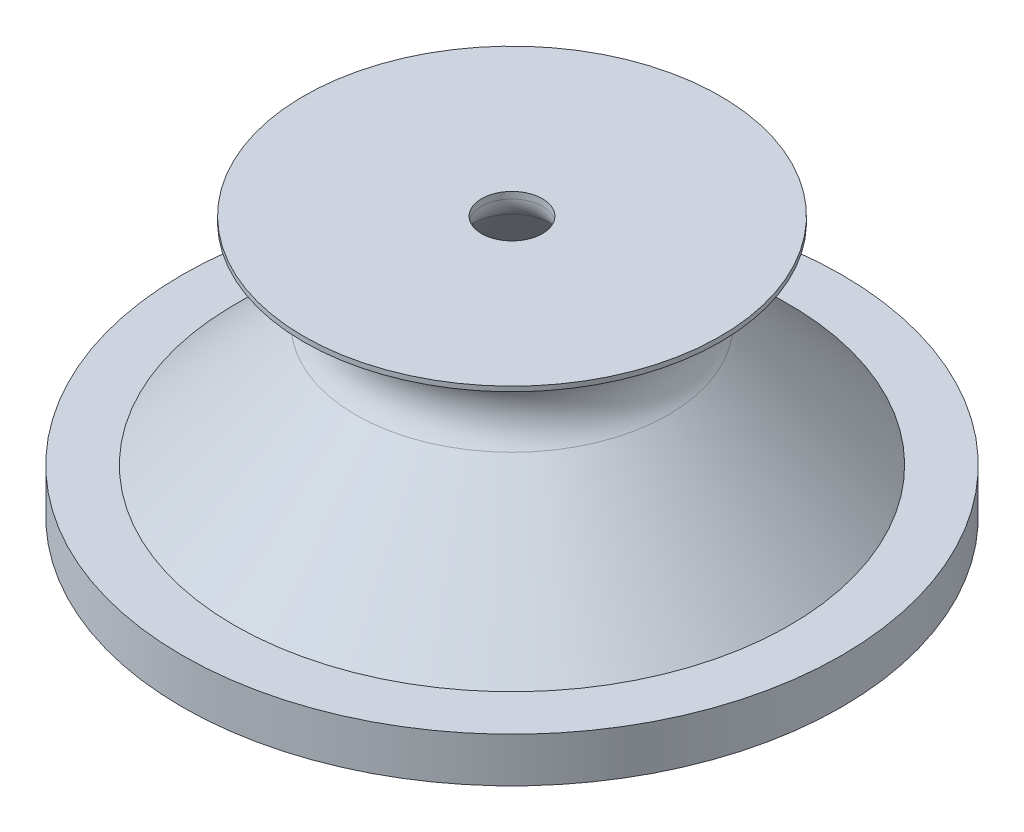
ISO-10303-21;
HEADER;
FILE_DESCRIPTION(('STEP AP214'),'2;1');
FILE_NAME('part.step','',(''),(''),'','','');
FILE_SCHEMA(('AUTOMOTIVE_DESIGN { 1 0 10303 214 1 1 1 1 }'));
ENDSEC;
DATA;
#1=APPLICATION_CONTEXT('core data for automotive mechanical design processes');
#2=APPLICATION_PROTOCOL_DEFINITION('international standard','automotive_design',2000,#1);
#3=PRODUCT_CONTEXT('',#1,'mechanical');
#4=PRODUCT('Part','Part','',(#3));
#5=PRODUCT_RELATED_PRODUCT_CATEGORY('part','',(#4));
#6=PRODUCT_DEFINITION_FORMATION('','',#4);
#7=PRODUCT_DEFINITION_CONTEXT('part definition',#1,'design');
#8=PRODUCT_DEFINITION('design','',#6,#7);
#9=PRODUCT_DEFINITION_SHAPE('','',#8);
#10=(LENGTH_UNIT() NAMED_UNIT(*) SI_UNIT(.MILLI.,.METRE.));
#11=(NAMED_UNIT(*) PLANE_ANGLE_UNIT() SI_UNIT($,.RADIAN.));
#12=(NAMED_UNIT(*) SI_UNIT($,.STERADIAN.) SOLID_ANGLE_UNIT());
#13=UNCERTAINTY_MEASURE_WITH_UNIT(LENGTH_MEASURE(1.E-05),#10,'distance_accuracy_value','');
#14=(GEOMETRIC_REPRESENTATION_CONTEXT(3) GLOBAL_UNCERTAINTY_ASSIGNED_CONTEXT((#13)) GLOBAL_UNIT_ASSIGNED_CONTEXT((#10,
#11,#12)) REPRESENTATION_CONTEXT('',''));
#15=CARTESIAN_POINT('',(0.,0.,0.));
#16=DIRECTION('',(0.,0.,1.));
#17=DIRECTION('',(1.,0.,0.));
#18=AXIS2_PLACEMENT_3D('',#15,#16,#17);
#19=CARTESIAN_POINT('',(0.,49.2844881441796,0.));
#20=DIRECTION('',(0.,1.,0.));
#21=DIRECTION('',(0.,0.,1.));
#22=AXIS2_PLACEMENT_3D('',#19,#20,#21);
#23=CYLINDRICAL_SURFACE('',#22,38.);
#24=CARTESIAN_POINT('',(0.,5.1568542494921,0.));
#25=DIRECTION('',(0.,1.,0.));
#26=DIRECTION('',(0.,0.,1.));
#27=AXIS2_PLACEMENT_3D('',#24,#25,#26);
#28=CIRCLE('',#27,38.);
#29=CARTESIAN_POINT('',(0.,5.1568542494921,38.));
#30=VERTEX_POINT('',#29);
#31=EDGE_CURVE('E10',#30,#30,#28,.T.);
#32=ORIENTED_EDGE('',*,*,#31,.F.);
#33=EDGE_LOOP('',(#32));
#34=FACE_BOUND('',#33,.T.);
#35=CARTESIAN_POINT('',(0.,0.,0.));
#36=DIRECTION('',(0.,1.,0.));
#37=DIRECTION('',(0.,0.,1.));
#38=AXIS2_PLACEMENT_3D('',#35,#36,#37);
#39=CIRCLE('',#38,38.);
#40=CARTESIAN_POINT('',(0.,0.,38.));
#41=VERTEX_POINT('',#40);
#42=EDGE_CURVE('E70',#41,#41,#39,.T.);
#43=ORIENTED_EDGE('',*,*,#42,.T.);
#44=EDGE_LOOP('',(#43));
#45=FACE_BOUND('',#44,.T.);
#46=ADVANCED_FACE('F33',(#34,#45),#23,.T.);
#47=CARTESIAN_POINT('',(32.,5.1568542494921,0.));
#48=DIRECTION('',(0.,-1.,0.));
#49=DIRECTION('',(0.,0.,-1.));
#50=AXIS2_PLACEMENT_3D('',#47,#48,#49);
#51=PLANE('',#50);
#52=CARTESIAN_POINT('',(0.,5.1568542494921,0.));
#53=DIRECTION('',(0.,1.,0.));
#54=DIRECTION('',(0.,0.,1.));
#55=AXIS2_PLACEMENT_3D('',#52,#53,#54);
#56=CIRCLE('',#55,32.);
#57=CARTESIAN_POINT('',(0.,5.1568542494921,32.));
#58=VERTEX_POINT('',#57);
#59=EDGE_CURVE('E39',#58,#58,#56,.T.);
#60=ORIENTED_EDGE('',*,*,#59,.F.);
#61=EDGE_LOOP('',(#60));
#62=FACE_BOUND('',#61,.T.);
#63=ORIENTED_EDGE('',*,*,#31,.T.);
#64=EDGE_LOOP('',(#63));
#65=FACE_BOUND('',#64,.T.);
#66=ADVANCED_FACE('F125',(#62,#65),#51,.F.);
#67=CARTESIAN_POINT('',(0.,5.1568542494921,0.));
#68=DIRECTION('',(0.,-1.,0.));
#69=DIRECTION('',(0.,0.,-1.));
#70=AXIS2_PLACEMENT_3D('',#67,#68,#69);
#71=CONICAL_SURFACE('',#70,32.,0.785398163397443);
#72=CARTESIAN_POINT('',(0.,19.1571187291735,0.));
#73=DIRECTION('',(0.,1.,0.));
#74=DIRECTION('',(0.,0.,1.));
#75=AXIS2_PLACEMENT_3D('',#72,#73,#74);
#76=CIRCLE('',#75,17.9997355203188);
#77=CARTESIAN_POINT('',(0.,19.1571187291735,17.9997355203188));
#78=VERTEX_POINT('',#77);
#79=EDGE_CURVE('E43',#78,#78,#76,.T.);
#80=ORIENTED_EDGE('',*,*,#79,.F.);
#81=EDGE_LOOP('',(#80));
#82=FACE_BOUND('',#81,.T.);
#83=ORIENTED_EDGE('',*,*,#59,.T.);
#84=EDGE_LOOP('',(#83));
#85=FACE_BOUND('',#84,.T.);
#86=ADVANCED_FACE('F120',(#82,#85),#71,.T.);
#87=CARTESIAN_POINT('',(0.,22.6926526351062,0.));
#88=DIRECTION('',(0.,1.,0.));
#89=DIRECTION('',(0.,0.,1.));
#90=AXIS2_PLACEMENT_3D('',#87,#88,#89);
#91=TOROIDAL_SURFACE('',#90,21.5352694262516,5.);
#92=CARTESIAN_POINT('',(0.,27.2934360491168,0.));
#93=DIRECTION('',(0.,1.,0.));
#94=DIRECTION('',(0.,0.,1.));
#95=AXIS2_PLACEMENT_3D('',#92,#93,#94);
#96=CIRCLE('',#95,19.5775176602287);
#97=CARTESIAN_POINT('',(19.5775176602287,27.2934360491168,0.));
#98=VERTEX_POINT('',#97);
#99=EDGE_CURVE('E47',#98,#98,#96,.T.);
#100=ORIENTED_EDGE('',*,*,#99,.F.);
#101=EDGE_LOOP('',(#100));
#102=FACE_BOUND('',#101,.T.);
#103=ORIENTED_EDGE('',*,*,#79,.T.);
#104=EDGE_LOOP('',(#103));
#105=FACE_BOUND('',#104,.T.);
#106=ADVANCED_FACE('F114',(#102,#105),#91,.F.);
#107=CARTESIAN_POINT('',(0.,73.3012701892221,0.));
#108=DIRECTION('',(0.,1.,0.));
#109=DIRECTION('',(1.,0.,0.));
#110=AXIS2_PLACEMENT_3D('',#107,#108,#109);
#111=SPHERICAL_SURFACE('',#110,50.0000000000001);
#112=CARTESIAN_POINT('',(0.,29.4378457902993,0.));
#113=DIRECTION('',(0.,1.,0.));
#114=DIRECTION('',(0.,0.,1.));
#115=AXIS2_PLACEMENT_3D('',#112,#113,#114);
#116=CIRCLE('',#115,23.9999999999996);
#117=CARTESIAN_POINT('',(23.9999999999998,29.4378457902993,0.));
#118=VERTEX_POINT('',#117);
#119=EDGE_CURVE('E52',#118,#118,#116,.T.);
#120=CARTESIAN_POINT('',(23.9999999999998,29.4378457902993,0.));
#121=CARTESIAN_POINT('',(23.9550679334542,29.4132610793421,0.));
#122=CARTESIAN_POINT('',(23.9100980911581,29.3887454089618,0.));
#123=CARTESIAN_POINT('',(23.8200832803137,29.3398523798476,0.));
#124=CARTESIAN_POINT('',(23.7750383117654,29.3154750211137,0.));
#125=CARTESIAN_POINT('',(23.6848736736656,29.2668588457848,0.));
#126=CARTESIAN_POINT('',(23.6397540041139,29.2426200291898,0.));
#127=CARTESIAN_POINT('',(23.5494403901517,29.194281166973,0.));
#128=CARTESIAN_POINT('',(23.5042464457411,29.1701811213512,0.));
#129=CARTESIAN_POINT('',(23.4137847088558,29.1221200286983,0.));
#130=CARTESIAN_POINT('',(23.368516916381,29.0981589816671,0.));
#131=CARTESIAN_POINT('',(23.2779079108734,29.0503761124751,0.));
#132=CARTESIAN_POINT('',(23.2325666978404,29.0265542903142,0.));
#133=CARTESIAN_POINT('',(23.1418112794119,28.9790500958342,0.));
#134=CARTESIAN_POINT('',(23.0963970740164,28.9553677235152,0.));
#135=CARTESIAN_POINT('',(23.0054960997488,28.9081426523717,0.));
#136=CARTESIAN_POINT('',(22.9600093308766,28.8845999535473,0.));
#137=CARTESIAN_POINT('',(22.8689636592267,28.8376544517273,0.));
#138=CARTESIAN_POINT('',(22.8234047564489,28.8142516487318,0.));
#139=CARTESIAN_POINT('',(22.7322152472399,28.7675861595825,0.));
#140=CARTESIAN_POINT('',(22.6865846408088,28.7443234734288,0.));
#141=CARTESIAN_POINT('',(22.5952521552224,28.6979384376529,0.));
#142=CARTESIAN_POINT('',(22.5495502760672,28.6748160880307,0.));
#143=CARTESIAN_POINT('',(22.4580756766354,28.6287119436823,0.));
#144=CARTESIAN_POINT('',(22.4123029563587,28.6057301489561,0.));
#145=CARTESIAN_POINT('',(22.3206871069554,28.5599073314367,0.));
#146=CARTESIAN_POINT('',(22.2748439778287,28.5370663086435,0.));
#147=CARTESIAN_POINT('',(22.1830877436618,28.4915252506976,0.));
#148=CARTESIAN_POINT('',(22.1371746386216,28.4688252155449,0.));
#149=CARTESIAN_POINT('',(22.0452788862249,28.4235663472564,0.));
#150=CARTESIAN_POINT('',(21.9992962388685,28.4010075141204,0.));
#151=CARTESIAN_POINT('',(21.9072618360933,28.3560312629079,0.));
#152=CARTESIAN_POINT('',(21.8612100806746,28.3336138448313,0.));
#153=CARTESIAN_POINT('',(21.7690378966817,28.2889206354445,0.));
#154=CARTESIAN_POINT('',(21.7229174681074,28.2666448441344,0.));
#155=CARTESIAN_POINT('',(21.6306083733586,28.2222350986502,0.));
#156=CARTESIAN_POINT('',(21.5844197071841,28.2001011444762,0.));
#157=CARTESIAN_POINT('',(21.4919745734342,28.1559752822943,0.));
#158=CARTESIAN_POINT('',(21.445718105859,28.1339833742865,0.));
#159=CARTESIAN_POINT('',(21.3531378061478,28.0901418121258,0.));
#160=CARTESIAN_POINT('',(21.3068139740118,28.0682921579728,0.));
#161=CARTESIAN_POINT('',(21.2140993826553,28.0247353098671,0.));
#162=CARTESIAN_POINT('',(21.1677086234347,28.0030281159143,0.));
#163=CARTESIAN_POINT('',(21.0748606160172,27.9597563932087,0.));
#164=CARTESIAN_POINT('',(21.0284033678202,27.9381918644559,0.));
#165=CARTESIAN_POINT('',(20.935422821186,27.8952056758029,0.));
#166=CARTESIAN_POINT('',(20.8888995227487,27.8737840159026,0.));
#167=CARTESIAN_POINT('',(20.7957873149938,27.831083767258,0.));
#168=CARTESIAN_POINT('',(20.7491984056761,27.8098051785136,0.));
#169=CARTESIAN_POINT('',(20.6559554161398,27.7673912731329,0.));
#170=CARTESIAN_POINT('',(20.6093013359211,27.7462559564966,0.));
#171=CARTESIAN_POINT('',(20.5159284451779,27.7041287949311,0.));
#172=CARTESIAN_POINT('',(20.4692096346533,27.6831369500019,0.));
#173=CARTESIAN_POINT('',(20.3757077245043,27.6412969300951,0.));
#174=CARTESIAN_POINT('',(20.3289246248798,27.6204487551176,0.));
#175=CARTESIAN_POINT('',(20.2352945783451,27.5788962720002,0.));
#176=CARTESIAN_POINT('',(20.1884476314349,27.5581919638603,0.));
#177=CARTESIAN_POINT('',(20.0946903327425,27.5169274099523,0.));
#178=CARTESIAN_POINT('',(20.0477799809604,27.4963671641843,0.));
#179=CARTESIAN_POINT('',(19.9538963155484,27.4553909291678,0.));
#180=CARTESIAN_POINT('',(19.9069230019185,27.4349749399192,0.));
#181=CARTESIAN_POINT('',(19.8129138563874,27.3942874108247,0.));
#182=CARTESIAN_POINT('',(19.7658780244863,27.3740158709788,0.));
#183=CARTESIAN_POINT('',(19.6717442867369,27.3336174318427,0.));
#184=CARTESIAN_POINT('',(19.6246463808885,27.3134905325525,0.));
#185=CARTESIAN_POINT('',(19.5775176602287,27.2934360491168,0.));
#186=B_SPLINE_CURVE_WITH_KNOTS('',3,(#120,#121,#122,#123,#124,#125,#126,#127,#128,#129,#130,
#131,#132,#133,#134,#135,#136,#137,#138,#139,#140,#141,#142,#143,#144,#145,#146,#147,#148,#149,
#150,#151,#152,#153,#154,#155,#156,#157,#158,#159,#160,#161,#162,#163,#164,#165,#166,#167,#168,
#169,#170,#171,#172,#173,#174,#175,#176,#177,#178,#179,#180,#181,#182,#183,#184,#185),
.UNSPECIFIED.,.F.,.F.,(4,2,2,2,2,2,2,2,2,2,2,2,2,2,2,2,2,2,2,2,2,2,2,2,2,2,2,2,2,2,2,2,4),(0.,
0.153654381554542,0.307308763109078,0.460963144663622,0.61461752621817,0.768271907772701,
0.921926289327242,1.07558067088179,1.22923505243633,1.38288943399087,1.53654381554541,
1.69019819709995,1.84385257865449,1.99750696020903,2.15116134176358,2.30481572331811,
2.45847010487265,2.6121244864272,2.76577886798173,2.91943324953627,3.07308763109082,
3.22674201264535,3.3803963941999,3.53405077575444,3.68770515730898,3.84135953886352,
3.99501392041806,4.14866830197261,4.30232268352714,4.45597706508168,4.60963144663623,
4.76328582819076,4.91694020974531),.UNSPECIFIED.);
#187=EDGE_CURVE('BSEAM108',#118,#98,#186,.T.);
#188=ORIENTED_EDGE('',*,*,#119,.F.);
#189=ORIENTED_EDGE('',*,*,#99,.T.);
#190=ORIENTED_EDGE('',*,*,#187,.T.);
#191=ORIENTED_EDGE('',*,*,#187,.F.);
#192=EDGE_LOOP('',(#188,#190,#189,#191));
#193=FACE_BOUND('',#192,.T.);
#194=ADVANCED_FACE('F108',(#193),#111,.T.);
#195=CARTESIAN_POINT('',(0.,49.2844881441796,0.));
#196=DIRECTION('',(0.,1.,0.));
#197=DIRECTION('',(0.,0.,1.));
#198=AXIS2_PLACEMENT_3D('',#195,#196,#197);
#199=CYLINDRICAL_SURFACE('',#198,23.9999999999998);
#200=CARTESIAN_POINT('',(0.,30.,0.));
#201=DIRECTION('',(0.,1.,0.));
#202=DIRECTION('',(0.,0.,1.));
#203=AXIS2_PLACEMENT_3D('',#200,#201,#202);
#204=CIRCLE('',#203,24.);
#205=CARTESIAN_POINT('',(0.,30.,24.));
#206=VERTEX_POINT('',#205);
#207=EDGE_CURVE('E55',#206,#206,#204,.T.);
#208=ORIENTED_EDGE('',*,*,#207,.F.);
#209=EDGE_LOOP('',(#208));
#210=FACE_BOUND('',#209,.T.);
#211=ORIENTED_EDGE('',*,*,#119,.T.);
#212=EDGE_LOOP('',(#211));
#213=FACE_BOUND('',#212,.T.);
#214=ADVANCED_FACE('F102',(#210,#213),#199,.T.);
#215=CARTESIAN_POINT('',(24.,30.,0.));
#216=DIRECTION('',(0.,-1.,0.));
#217=DIRECTION('',(0.,0.,-1.));
#218=AXIS2_PLACEMENT_3D('',#215,#216,#217);
#219=PLANE('',#218);
#220=CARTESIAN_POINT('',(0.,30.,0.));
#221=DIRECTION('',(0.,1.,0.));
#222=DIRECTION('',(0.,0.,1.));
#223=AXIS2_PLACEMENT_3D('',#220,#221,#222);
#224=CIRCLE('',#223,3.5);
#225=CARTESIAN_POINT('',(0.,30.,3.5));
#226=VERTEX_POINT('',#225);
#227=EDGE_CURVE('E58',#226,#226,#224,.T.);
#228=ORIENTED_EDGE('',*,*,#227,.F.);
#229=EDGE_LOOP('',(#228));
#230=FACE_BOUND('',#229,.T.);
#231=ORIENTED_EDGE('',*,*,#207,.T.);
#232=EDGE_LOOP('',(#231));
#233=FACE_BOUND('',#232,.T.);
#234=ADVANCED_FACE('F96',(#230,#233),#219,.F.);
#235=CARTESIAN_POINT('',(0.,49.2844881441796,0.));
#236=DIRECTION('',(0.,1.,0.));
#237=DIRECTION('',(0.,0.,1.));
#238=AXIS2_PLACEMENT_3D('',#235,#236,#237);
#239=CYLINDRICAL_SURFACE('',#238,3.5);
#240=CARTESIAN_POINT('',(0.,29.2426406871193,0.));
#241=DIRECTION('',(0.,1.,0.));
#242=DIRECTION('',(0.,0.,1.));
#243=AXIS2_PLACEMENT_3D('',#240,#241,#242);
#244=CIRCLE('',#243,3.5);
#245=CARTESIAN_POINT('',(0.,29.2426406871193,3.5));
#246=VERTEX_POINT('',#245);
#247=EDGE_CURVE('E61',#246,#246,#244,.T.);
#248=ORIENTED_EDGE('',*,*,#247,.F.);
#249=EDGE_LOOP('',(#248));
#250=FACE_BOUND('',#249,.T.);
#251=ORIENTED_EDGE('',*,*,#227,.T.);
#252=EDGE_LOOP('',(#251));
#253=FACE_BOUND('',#252,.T.);
#254=ADVANCED_FACE('F90',(#250,#253),#239,.F.);
#255=CARTESIAN_POINT('',(0.,29.2426406871193,0.));
#256=DIRECTION('',(0.,1.,0.));
#257=DIRECTION('',(0.,0.,1.));
#258=AXIS2_PLACEMENT_3D('',#255,#256,#257);
#259=TOROIDAL_SURFACE('',#258,6.5,3.);
#260=CARTESIAN_POINT('',(0.,27.1213203435596,0.));
#261=DIRECTION('',(0.,1.,0.));
#262=DIRECTION('',(0.,0.,1.));
#263=AXIS2_PLACEMENT_3D('',#260,#261,#262);
#264=CIRCLE('',#263,4.37867965644035);
#265=CARTESIAN_POINT('',(0.,27.1213203435596,-4.37867965644035));
#266=VERTEX_POINT('',#265);
#267=EDGE_CURVE('E64',#266,#266,#264,.T.);
#268=ORIENTED_EDGE('',*,*,#267,.F.);
#269=EDGE_LOOP('',(#268));
#270=FACE_BOUND('',#269,.T.);
#271=ORIENTED_EDGE('',*,*,#247,.T.);
#272=EDGE_LOOP('',(#271));
#273=FACE_BOUND('',#272,.T.);
#274=ADVANCED_FACE('F84',(#270,#273),#259,.T.);
#275=CARTESIAN_POINT('',(0.,27.1213203435596,0.));
#276=DIRECTION('',(0.,-1.,0.));
#277=DIRECTION('',(0.,0.,-1.));
#278=AXIS2_PLACEMENT_3D('',#275,#276,#277);
#279=CONICAL_SURFACE('',#278,4.37867965644035,0.785398163397443);
#280=CARTESIAN_POINT('',(0.,0.,0.));
#281=DIRECTION('',(0.,1.,0.));
#282=DIRECTION('',(0.,0.,1.));
#283=AXIS2_PLACEMENT_3D('',#280,#281,#282);
#284=CIRCLE('',#283,31.4999999999997);
#285=CARTESIAN_POINT('',(0.,0.,-31.4999999999997));
#286=VERTEX_POINT('',#285);
#287=EDGE_CURVE('E67',#286,#286,#284,.T.);
#288=CARTESIAN_POINT('',(0.,0.,-31.4999999999997));
#289=CARTESIAN_POINT('',(0.,0.282513753578745,-31.217486246421));
#290=CARTESIAN_POINT('',(0.,0.565027507157492,-30.9349724928422));
#291=CARTESIAN_POINT('',(0.,1.13005501431498,-30.3699449856847));
#292=CARTESIAN_POINT('',(0.,1.41256876789373,-30.087431232106));
#293=CARTESIAN_POINT('',(0.,1.97759627505122,-29.5224037249485));
#294=CARTESIAN_POINT('',(0.,2.26011002862997,-29.2398899713697));
#295=CARTESIAN_POINT('',(0.,2.82513753578746,-28.6748624642123));
#296=CARTESIAN_POINT('',(0.,3.10765128936621,-28.3923487106335));
#297=CARTESIAN_POINT('',(0.,3.6726787965237,-27.827321203476));
#298=CARTESIAN_POINT('',(0.,3.95519255010245,-27.5448074498973));
#299=CARTESIAN_POINT('',(0.,4.52022005725994,-26.9797799427398));
#300=CARTESIAN_POINT('',(0.,4.80273381083868,-26.6972661891611));
#301=CARTESIAN_POINT('',(0.,5.36776131799618,-26.1322386820036));
#302=CARTESIAN_POINT('',(0.,5.65027507157492,-25.8497249284248));
#303=CARTESIAN_POINT('',(0.,6.21530257873242,-25.2846974212673));
#304=CARTESIAN_POINT('',(0.,6.49781633231116,-25.0021836676886));
#305=CARTESIAN_POINT('',(0.,7.06284383946865,-24.4371561605311));
#306=CARTESIAN_POINT('',(0.,7.3453575930474,-24.1546424069524));
#307=CARTESIAN_POINT('',(0.,7.91038510020489,-23.5896148997949));
#308=CARTESIAN_POINT('',(0.,8.19289885378364,-23.3071011462161));
#309=CARTESIAN_POINT('',(0.,8.75792636094113,-22.7420736390587));
#310=CARTESIAN_POINT('',(0.,9.04044011451988,-22.4595598854799));
#311=CARTESIAN_POINT('',(0.,9.60546762167737,-21.8945323783224));
#312=CARTESIAN_POINT('',(0.,9.88798137525612,-21.6120186247437));
#313=CARTESIAN_POINT('',(0.,10.4530088824136,-21.0469911175862));
#314=CARTESIAN_POINT('',(0.,10.7355226359924,-20.7644773640075));
#315=CARTESIAN_POINT('',(0.,11.3005501431498,-20.19944985685));
#316=CARTESIAN_POINT('',(0.,11.5830638967286,-19.9169361032712));
#317=CARTESIAN_POINT('',(0.,12.1480914038861,-19.3519085961137));
#318=CARTESIAN_POINT('',(0.,12.4306051574648,-19.069394842535));
#319=CARTESIAN_POINT('',(0.,12.9956326646223,-18.5043673353775));
#320=CARTESIAN_POINT('',(0.,13.2781464182011,-18.2218535817988));
#321=CARTESIAN_POINT('',(0.,13.8431739253586,-17.6568260746413));
#322=CARTESIAN_POINT('',(0.,14.1256876789373,-17.3743123210625));
#323=CARTESIAN_POINT('',(0.,14.6907151860948,-16.809284813905));
#324=CARTESIAN_POINT('',(0.,14.9732289396735,-16.5267710603263));
#325=CARTESIAN_POINT('',(0.,15.538256446831,-15.9617435531688));
#326=CARTESIAN_POINT('',(0.,15.8207702004098,-15.6792297995901));
#327=CARTESIAN_POINT('',(0.,16.3857977075673,-15.1142022924326));
#328=CARTESIAN_POINT('',(0.,16.668311461146,-14.8316885388538));
#329=CARTESIAN_POINT('',(0.,17.2333389683035,-14.2666610316964));
#330=CARTESIAN_POINT('',(0.,17.5158527218823,-13.9841472781176));
#331=CARTESIAN_POINT('',(0.,18.0808802290398,-13.4191197709601));
#332=CARTESIAN_POINT('',(0.,18.3633939826185,-13.1366060173814));
#333=CARTESIAN_POINT('',(0.,18.928421489776,-12.5715785102239));
#334=CARTESIAN_POINT('',(0.,19.2109352433547,-12.2890647566452));
#335=CARTESIAN_POINT('',(0.,19.7759627505122,-11.7240372494877));
#336=CARTESIAN_POINT('',(0.,20.058476504091,-11.4415234959089));
#337=CARTESIAN_POINT('',(0.,20.6235040112485,-10.8764959887514));
#338=CARTESIAN_POINT('',(0.,20.9060177648272,-10.5939822351727));
#339=CARTESIAN_POINT('',(0.,21.4710452719847,-10.0289547280152));
#340=CARTESIAN_POINT('',(0.,21.7535590255635,-9.74644097443647));
#341=CARTESIAN_POINT('',(0.,22.318586532721,-9.18141346727898));
#342=CARTESIAN_POINT('',(0.,22.6011002862997,-8.89889971370024));
#343=CARTESIAN_POINT('',(0.,23.1661277934572,-8.33387220654275));
#344=CARTESIAN_POINT('',(0.,23.4486415470359,-8.05135845296401));
#345=CARTESIAN_POINT('',(0.,24.0136690541934,-7.48633094580652));
#346=CARTESIAN_POINT('',(0.,24.2961828077722,-7.20381719222778));
#347=CARTESIAN_POINT('',(0.,24.8612103149297,-6.63878968507029));
#348=CARTESIAN_POINT('',(0.,25.1437240685084,-6.35627593149155));
#349=CARTESIAN_POINT('',(0.,25.7087515756659,-5.79124842433406));
#350=CARTESIAN_POINT('',(0.,25.9912653292447,-5.50873467075532));
#351=CARTESIAN_POINT('',(0.,26.5562928364021,-4.94370716359783));
#352=CARTESIAN_POINT('',(0.,26.8388065899809,-4.66119341001909));
#353=CARTESIAN_POINT('',(0.,27.1213203435596,-4.37867965644035));
#354=B_SPLINE_CURVE_WITH_KNOTS('',3,(#288,#289,#290,#291,#292,#293,#294,#295,#296,#297,#298,
#299,#300,#301,#302,#303,#304,#305,#306,#307,#308,#309,#310,#311,#312,#313,#314,#315,#316,#317,
#318,#319,#320,#321,#322,#323,#324,#325,#326,#327,#328,#329,#330,#331,#332,#333,#334,#335,#336,
#337,#338,#339,#340,#341,#342,#343,#344,#345,#346,#347,#348,#349,#350,#351,#352,#353),
.UNSPECIFIED.,.F.,.F.,(4,2,2,2,2,2,2,2,2,2,2,2,2,2,2,2,2,2,2,2,2,2,2,2,2,2,2,2,2,2,2,2,4),(0.,
1.19860434560397,2.39720869120795,3.59581303681192,4.79441738241589,5.99302172801987,
7.19162607362384,8.39023041922781,9.58883476483179,10.7874391104358,11.9860434560397,
13.1846478016437,14.3832521472477,15.5818564928517,16.7804608384556,17.9790651840596,
19.1776695296636,20.3762738752676,21.5748782208715,22.7734825664755,23.9720869120795,
25.1706912576834,26.3692956032874,27.5678999488914,28.7665042944954,29.9651086400993,
31.1637129857033,32.3623173313073,33.5609216769113,34.7595260225152,35.9581303681192,
37.1567347137232,38.3553390593272),.UNSPECIFIED.);
#355=EDGE_CURVE('BSEAM78',#286,#266,#354,.T.);
#356=ORIENTED_EDGE('',*,*,#287,.F.);
#357=ORIENTED_EDGE('',*,*,#267,.T.);
#358=ORIENTED_EDGE('',*,*,#355,.T.);
#359=ORIENTED_EDGE('',*,*,#355,.F.);
#360=EDGE_LOOP('',(#356,#358,#357,#359));
#361=FACE_BOUND('',#360,.T.);
#362=ADVANCED_FACE('F78',(#361),#279,.F.);
#363=CARTESIAN_POINT('',(31.4999999999997,0.,0.));
#364=DIRECTION('',(0.,1.,0.));
#365=DIRECTION('',(0.,0.,1.));
#366=AXIS2_PLACEMENT_3D('',#363,#364,#365);
#367=PLANE('',#366);
#368=ORIENTED_EDGE('',*,*,#42,.F.);
#369=EDGE_LOOP('',(#368));
#370=FACE_BOUND('',#369,.T.);
#371=ORIENTED_EDGE('',*,*,#287,.T.);
#372=EDGE_LOOP('',(#371));
#373=FACE_BOUND('',#372,.T.);
#374=ADVANCED_FACE('F75',(#370,#373),#367,.F.);
#375=CLOSED_SHELL('',(#46,#66,#86,#106,#194,#214,#234,#254,#274,#362,#374));
#376=MANIFOLD_SOLID_BREP('B2',#375);
#377=ADVANCED_BREP_SHAPE_REPRESENTATION('',(#18,#376),#14);
#378=SHAPE_DEFINITION_REPRESENTATION(#9,#377);
ENDSEC;
END-ISO-10303-21;
